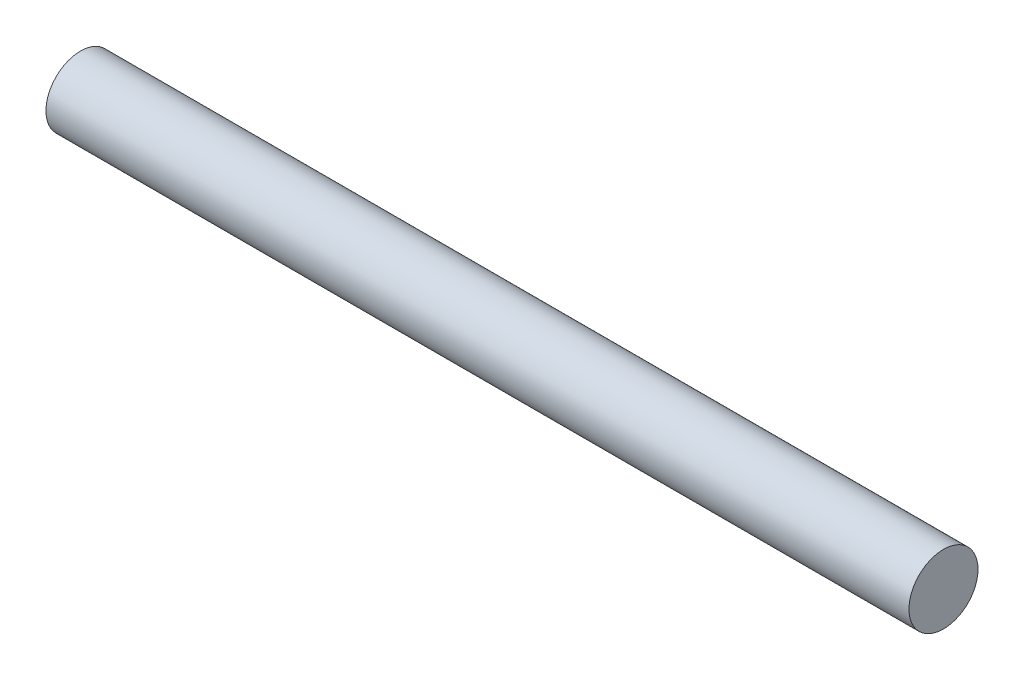
ISO-10303-21;
HEADER;
FILE_DESCRIPTION(('STEP AP214'),'2;1');
FILE_NAME('part.step','',(''),(''),'','','');
FILE_SCHEMA(('AUTOMOTIVE_DESIGN { 1 0 10303 214 1 1 1 1 }'));
ENDSEC;
DATA;
#1=APPLICATION_CONTEXT('core data for automotive mechanical design processes');
#2=APPLICATION_PROTOCOL_DEFINITION('international standard','automotive_design',2000,#1);
#3=PRODUCT_CONTEXT('',#1,'mechanical');
#4=PRODUCT('Part','Part','',(#3));
#5=PRODUCT_RELATED_PRODUCT_CATEGORY('part','',(#4));
#6=PRODUCT_DEFINITION_FORMATION('','',#4);
#7=PRODUCT_DEFINITION_CONTEXT('part definition',#1,'design');
#8=PRODUCT_DEFINITION('design','',#6,#7);
#9=PRODUCT_DEFINITION_SHAPE('','',#8);
#10=(LENGTH_UNIT() NAMED_UNIT(*) SI_UNIT(.MILLI.,.METRE.));
#11=(NAMED_UNIT(*) PLANE_ANGLE_UNIT() SI_UNIT($,.RADIAN.));
#12=(NAMED_UNIT(*) SI_UNIT($,.STERADIAN.) SOLID_ANGLE_UNIT());
#13=UNCERTAINTY_MEASURE_WITH_UNIT(LENGTH_MEASURE(1.E-05),#10,'distance_accuracy_value','');
#14=(GEOMETRIC_REPRESENTATION_CONTEXT(3) GLOBAL_UNCERTAINTY_ASSIGNED_CONTEXT((#13)) GLOBAL_UNIT_ASSIGNED_CONTEXT((#10,
#11,#12)) REPRESENTATION_CONTEXT('',''));
#15=CARTESIAN_POINT('',(0.,0.,0.));
#16=DIRECTION('',(0.,0.,1.));
#17=DIRECTION('',(1.,0.,0.));
#18=AXIS2_PLACEMENT_3D('',#15,#16,#17);
#19=CARTESIAN_POINT('',(100.,0.,0.));
#20=DIRECTION('',(-1.,0.,0.));
#21=DIRECTION('',(0.,0.,1.));
#22=AXIS2_PLACEMENT_3D('',#19,#20,#21);
#23=CYLINDRICAL_SURFACE('',#22,4.);
#24=CARTESIAN_POINT('',(100.,0.,0.));
#25=DIRECTION('',(1.,0.,0.));
#26=DIRECTION('',(0.,0.,-1.));
#27=AXIS2_PLACEMENT_3D('',#24,#25,#26);
#28=CIRCLE('',#27,4.);
#29=CARTESIAN_POINT('',(100.,0.,-4.));
#30=VERTEX_POINT('',#29);
#31=EDGE_CURVE('E10',#30,#30,#28,.T.);
#32=ORIENTED_EDGE('',*,*,#31,.F.);
#33=EDGE_LOOP('',(#32));
#34=FACE_BOUND('',#33,.T.);
#35=CARTESIAN_POINT('',(0.,0.,0.));
#36=DIRECTION('',(1.,0.,0.));
#37=DIRECTION('',(0.,0.,-1.));
#38=AXIS2_PLACEMENT_3D('',#35,#36,#37);
#39=CIRCLE('',#38,4.);
#40=CARTESIAN_POINT('',(0.,0.,-4.));
#41=VERTEX_POINT('',#40);
#42=EDGE_CURVE('E34',#41,#41,#39,.T.);
#43=ORIENTED_EDGE('',*,*,#42,.T.);
#44=EDGE_LOOP('',(#43));
#45=FACE_BOUND('',#44,.T.);
#46=ADVANCED_FACE('F31',(#34,#45),#23,.T.);
#47=CARTESIAN_POINT('',(100.,0.,0.));
#48=DIRECTION('',(1.,0.,0.));
#49=DIRECTION('',(0.,0.,-1.));
#50=AXIS2_PLACEMENT_3D('',#47,#48,#49);
#51=PLANE('',#50);
#52=ORIENTED_EDGE('',*,*,#31,.T.);
#53=EDGE_LOOP('',(#52));
#54=FACE_BOUND('',#53,.T.);
#55=ADVANCED_FACE('F46',(#54),#51,.T.);
#56=CARTESIAN_POINT('',(0.,0.,0.));
#57=DIRECTION('',(1.,0.,0.));
#58=DIRECTION('',(0.,0.,-1.));
#59=AXIS2_PLACEMENT_3D('',#56,#57,#58);
#60=PLANE('',#59);
#61=ORIENTED_EDGE('',*,*,#42,.F.);
#62=EDGE_LOOP('',(#61));
#63=FACE_BOUND('',#62,.T.);
#64=ADVANCED_FACE('F44',(#63),#60,.F.);
#65=CLOSED_SHELL('',(#46,#55,#64));
#66=MANIFOLD_SOLID_BREP('B2',#65);
#67=ADVANCED_BREP_SHAPE_REPRESENTATION('',(#18,#66),#14);
#68=SHAPE_DEFINITION_REPRESENTATION(#9,#67);
ENDSEC;
END-ISO-10303-21;
